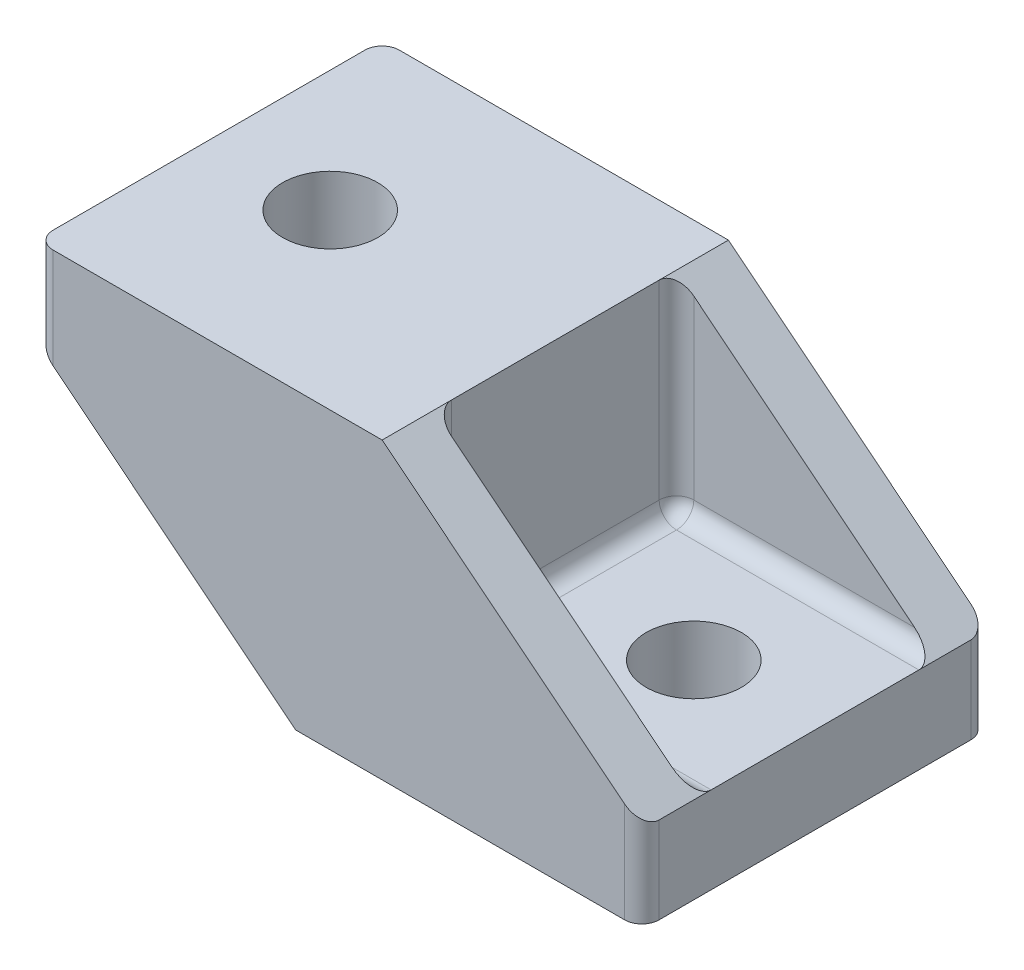
ISO-10303-21;
HEADER;
FILE_DESCRIPTION(('STEP AP214'),'2;1');
FILE_NAME('part.step','',(''),(''),'','','');
FILE_SCHEMA(('AUTOMOTIVE_DESIGN { 1 0 10303 214 1 1 1 1 }'));
ENDSEC;
DATA;
#1=APPLICATION_CONTEXT('core data for automotive mechanical design processes');
#2=APPLICATION_PROTOCOL_DEFINITION('international standard','automotive_design',2000,#1);
#3=PRODUCT_CONTEXT('',#1,'mechanical');
#4=PRODUCT('Part','Part','',(#3));
#5=PRODUCT_RELATED_PRODUCT_CATEGORY('part','',(#4));
#6=PRODUCT_DEFINITION_FORMATION('','',#4);
#7=PRODUCT_DEFINITION_CONTEXT('part definition',#1,'design');
#8=PRODUCT_DEFINITION('design','',#6,#7);
#9=PRODUCT_DEFINITION_SHAPE('','',#8);
#10=(LENGTH_UNIT() NAMED_UNIT(*) SI_UNIT(.MILLI.,.METRE.));
#11=(NAMED_UNIT(*) PLANE_ANGLE_UNIT() SI_UNIT($,.RADIAN.));
#12=(NAMED_UNIT(*) SI_UNIT($,.STERADIAN.) SOLID_ANGLE_UNIT());
#13=UNCERTAINTY_MEASURE_WITH_UNIT(LENGTH_MEASURE(1.E-05),#10,'distance_accuracy_value','');
#14=(GEOMETRIC_REPRESENTATION_CONTEXT(3) GLOBAL_UNCERTAINTY_ASSIGNED_CONTEXT((#13)) GLOBAL_UNIT_ASSIGNED_CONTEXT((#10,
#11,#12)) REPRESENTATION_CONTEXT('',''));
#15=CARTESIAN_POINT('',(0.,0.,0.));
#16=DIRECTION('',(0.,0.,1.));
#17=DIRECTION('',(1.,0.,0.));
#18=AXIS2_PLACEMENT_3D('',#15,#16,#17);
#19=CARTESIAN_POINT('',(0.,12.,10.));
#20=DIRECTION('',(0.,1.,0.));
#21=DIRECTION('',(-1.,0.,0.));
#22=AXIS2_PLACEMENT_3D('',#19,#20,#21);
#23=PLANE('',#22);
#24=CARTESIAN_POINT('',(-8.,12.,0.));
#25=DIRECTION('',(0.,1.,0.));
#26=DIRECTION('',(-1.,0.,0.));
#27=AXIS2_PLACEMENT_3D('',#24,#25,#26);
#28=CIRCLE('',#27,2.75);
#29=CARTESIAN_POINT('',(-10.75,12.,0.));
#30=VERTEX_POINT('',#29);
#31=EDGE_CURVE('E251',#30,#30,#28,.T.);
#32=ORIENTED_EDGE('',*,*,#31,.T.);
#33=EDGE_LOOP('',(#32));
#34=FACE_BOUND('',#33,.T.);
#35=DIRECTION('',(0.,0.,-1.));
#36=VECTOR('',#35,1.);
#37=CARTESIAN_POINT('',(-0.999999999999999,12.,7.));
#38=LINE('',#37,#36);
#39=CARTESIAN_POINT('',(-0.999999999999999,12.,-6.));
#40=VERTEX_POINT('',#39);
#41=CARTESIAN_POINT('',(-0.999999999999999,12.,6.));
#42=VERTEX_POINT('',#41);
#43=EDGE_CURVE('E320',#40,#42,#38,.F.);
#44=ORIENTED_EDGE('',*,*,#43,.T.);
#45=DIRECTION('',(1.,0.,0.));
#46=VECTOR('',#45,1.);
#47=CARTESIAN_POINT('',(-15.,12.,6.));
#48=LINE('',#47,#46);
#49=CARTESIAN_POINT('',(-15.,12.,6.));
#50=VERTEX_POINT('',#49);
#51=EDGE_CURVE('E323',#42,#50,#48,.F.);
#52=ORIENTED_EDGE('',*,*,#51,.T.);
#53=DIRECTION('',(0.,0.,-1.));
#54=VECTOR('',#53,1.);
#55=CARTESIAN_POINT('',(-15.,12.,10.));
#56=LINE('',#55,#54);
#57=CARTESIAN_POINT('',(-15.,12.,-6.));
#58=VERTEX_POINT('',#57);
#59=EDGE_CURVE('E255',#50,#58,#56,.T.);
#60=ORIENTED_EDGE('',*,*,#59,.T.);
#61=DIRECTION('',(-1.,0.,0.));
#62=VECTOR('',#61,1.);
#63=CARTESIAN_POINT('',(0.,12.,-6.));
#64=LINE('',#63,#62);
#65=EDGE_CURVE('E317',#58,#40,#64,.F.);
#66=ORIENTED_EDGE('',*,*,#65,.T.);
#67=EDGE_LOOP('',(#44,#52,#60,#66));
#68=FACE_BOUND('',#67,.T.);
#69=ADVANCED_FACE('F39',(#34,#68),#23,.F.);
#70=CARTESIAN_POINT('',(0.,0.,10.));
#71=DIRECTION('',(1.,0.,0.));
#72=DIRECTION('',(0.,1.,0.));
#73=AXIS2_PLACEMENT_3D('',#70,#71,#72);
#74=PLANE('',#73);
#75=DIRECTION('',(0.,0.,-1.));
#76=VECTOR('',#75,1.);
#77=CARTESIAN_POINT('',(0.,11.,-7.));
#78=LINE('',#77,#76);
#79=CARTESIAN_POINT('',(0.,11.,6.));
#80=VERTEX_POINT('',#79);
#81=CARTESIAN_POINT('',(0.,11.,-6.));
#82=VERTEX_POINT('',#81);
#83=EDGE_CURVE('E309',#80,#82,#78,.T.);
#84=ORIENTED_EDGE('',*,*,#83,.T.);
#85=DIRECTION('',(0.,1.,0.));
#86=VECTOR('',#85,1.);
#87=CARTESIAN_POINT('',(0.,0.,-6.));
#88=LINE('',#87,#86);
#89=CARTESIAN_POINT('',(0.,0.,-6.));
#90=VERTEX_POINT('',#89);
#91=EDGE_CURVE('E313',#82,#90,#88,.F.);
#92=ORIENTED_EDGE('',*,*,#91,.T.);
#93=DIRECTION('',(0.,0.,-1.));
#94=VECTOR('',#93,1.);
#95=CARTESIAN_POINT('',(0.,0.,10.));
#96=LINE('',#95,#94);
#97=CARTESIAN_POINT('',(0.,0.,6.));
#98=VERTEX_POINT('',#97);
#99=EDGE_CURVE('E235',#98,#90,#96,.T.);
#100=ORIENTED_EDGE('',*,*,#99,.F.);
#101=DIRECTION('',(0.,-1.,0.));
#102=VECTOR('',#101,1.);
#103=CARTESIAN_POINT('',(0.,12.,6.));
#104=LINE('',#103,#102);
#105=EDGE_CURVE('E306',#98,#80,#104,.F.);
#106=ORIENTED_EDGE('',*,*,#105,.T.);
#107=EDGE_LOOP('',(#84,#92,#100,#106));
#108=FACE_BOUND('',#107,.T.);
#109=ADVANCED_FACE('F492',(#108),#74,.F.);
#110=CARTESIAN_POINT('',(5.,5.,10.));
#111=DIRECTION('',(0.,-1.,0.));
#112=DIRECTION('',(1.,0.,0.));
#113=AXIS2_PLACEMENT_3D('',#110,#111,#112);
#114=PLANE('',#113);
#115=DIRECTION('',(0.,0.,-1.));
#116=VECTOR('',#115,1.);
#117=CARTESIAN_POINT('',(20.,5.,10.));
#118=LINE('',#117,#116);
#119=CARTESIAN_POINT('',(20.,5.,6.));
#120=VERTEX_POINT('',#119);
#121=CARTESIAN_POINT('',(20.,5.,-6.));
#122=VERTEX_POINT('',#121);
#123=EDGE_CURVE('E228',#120,#122,#118,.T.);
#124=ORIENTED_EDGE('',*,*,#123,.T.);
#125=DIRECTION('',(1.,0.,0.));
#126=VECTOR('',#125,1.);
#127=CARTESIAN_POINT('',(5.,5.,-6.));
#128=LINE('',#127,#126);
#129=CARTESIAN_POINT('',(6.,5.,-6.));
#130=VERTEX_POINT('',#129);
#131=EDGE_CURVE('E297',#122,#130,#128,.F.);
#132=ORIENTED_EDGE('',*,*,#131,.T.);
#133=DIRECTION('',(0.,0.,-1.));
#134=VECTOR('',#133,1.);
#135=CARTESIAN_POINT('',(6.,5.,7.));
#136=LINE('',#135,#134);
#137=CARTESIAN_POINT('',(6.,5.,6.));
#138=VERTEX_POINT('',#137);
#139=EDGE_CURVE('E290',#130,#138,#136,.F.);
#140=ORIENTED_EDGE('',*,*,#139,.T.);
#141=DIRECTION('',(-1.,0.,0.));
#142=VECTOR('',#141,1.);
#143=CARTESIAN_POINT('',(20.,5.,6.));
#144=LINE('',#143,#142);
#145=EDGE_CURVE('E293',#138,#120,#144,.F.);
#146=ORIENTED_EDGE('',*,*,#145,.T.);
#147=EDGE_LOOP('',(#124,#132,#140,#146));
#148=FACE_BOUND('',#147,.T.);
#149=CARTESIAN_POINT('',(13.,5.,0.));
#150=DIRECTION('',(0.,1.,0.));
#151=DIRECTION('',(-1.,0.,0.));
#152=AXIS2_PLACEMENT_3D('',#149,#150,#151);
#153=CIRCLE('',#152,2.75);
#154=CARTESIAN_POINT('',(10.25,5.,0.));
#155=VERTEX_POINT('',#154);
#156=EDGE_CURVE('E544',#155,#155,#153,.T.);
#157=ORIENTED_EDGE('',*,*,#156,.F.);
#158=EDGE_LOOP('',(#157));
#159=FACE_BOUND('',#158,.T.);
#160=ADVANCED_FACE('F576',(#148,#159),#114,.F.);
#161=CARTESIAN_POINT('',(5.,17.,10.));
#162=DIRECTION('',(-1.,0.,0.));
#163=DIRECTION('',(0.,-1.,0.));
#164=AXIS2_PLACEMENT_3D('',#161,#162,#163);
#165=PLANE('',#164);
#166=DIRECTION('',(0.,0.,-1.));
#167=VECTOR('',#166,1.);
#168=CARTESIAN_POINT('',(5.,6.,-7.));
#169=LINE('',#168,#167);
#170=CARTESIAN_POINT('',(5.,6.,6.));
#171=VERTEX_POINT('',#170);
#172=CARTESIAN_POINT('',(5.,6.,-6.));
#173=VERTEX_POINT('',#172);
#174=EDGE_CURVE('E280',#171,#173,#169,.T.);
#175=ORIENTED_EDGE('',*,*,#174,.T.);
#176=DIRECTION('',(0.,-1.,0.));
#177=VECTOR('',#176,1.);
#178=CARTESIAN_POINT('',(5.,17.,-6.));
#179=LINE('',#178,#177);
#180=CARTESIAN_POINT('',(4.99999999999999,17.,-6.));
#181=VERTEX_POINT('',#180);
#182=EDGE_CURVE('E286',#173,#181,#179,.F.);
#183=ORIENTED_EDGE('',*,*,#182,.T.);
#184=DIRECTION('',(0.,0.,-1.));
#185=VECTOR('',#184,1.);
#186=CARTESIAN_POINT('',(5.,17.,10.));
#187=LINE('',#186,#185);
#188=CARTESIAN_POINT('',(5.,17.,6.));
#189=VERTEX_POINT('',#188);
#190=EDGE_CURVE('E229',#189,#181,#187,.T.);
#191=ORIENTED_EDGE('',*,*,#190,.F.);
#192=DIRECTION('',(0.,1.,0.));
#193=VECTOR('',#192,1.);
#194=CARTESIAN_POINT('',(5.,5.,6.));
#195=LINE('',#194,#193);
#196=EDGE_CURVE('E283',#189,#171,#195,.F.);
#197=ORIENTED_EDGE('',*,*,#196,.T.);
#198=EDGE_LOOP('',(#175,#183,#191,#197));
#199=FACE_BOUND('',#198,.T.);
#200=ADVANCED_FACE('F842',(#199),#165,.F.);
#201=CARTESIAN_POINT('',(20.,0.,10.));
#202=DIRECTION('',(0.,1.,0.));
#203=DIRECTION('',(-1.,0.,0.));
#204=AXIS2_PLACEMENT_3D('',#201,#202,#203);
#205=PLANE('',#204);
#206=DIRECTION('',(1.,0.,0.));
#207=VECTOR('',#206,1.);
#208=CARTESIAN_POINT('',(20.,0.,-10.));
#209=LINE('',#208,#207);
#210=CARTESIAN_POINT('',(0.,0.,-10.));
#211=VERTEX_POINT('',#210);
#212=CARTESIAN_POINT('',(19.,0.,-10.));
#213=VERTEX_POINT('',#212);
#214=EDGE_CURVE('E247',#211,#213,#209,.T.);
#215=ORIENTED_EDGE('',*,*,#214,.T.);
#216=CARTESIAN_POINT('',(19.,0.,-9.));
#217=DIRECTION('',(0.,1.,0.));
#218=DIRECTION('',(-1.,0.,0.));
#219=AXIS2_PLACEMENT_3D('',#216,#217,#218);
#220=CIRCLE('',#219,1.);
#221=CARTESIAN_POINT('',(20.,0.,-9.));
#222=VERTEX_POINT('',#221);
#223=EDGE_CURVE('E431',#213,#222,#220,.F.);
#224=ORIENTED_EDGE('',*,*,#223,.T.);
#225=DIRECTION('',(0.,0.,-1.));
#226=VECTOR('',#225,1.);
#227=CARTESIAN_POINT('',(20.,0.,10.));
#228=LINE('',#227,#226);
#229=CARTESIAN_POINT('',(20.,0.,9.));
#230=VERTEX_POINT('',#229);
#231=EDGE_CURVE('E265',#230,#222,#228,.T.);
#232=ORIENTED_EDGE('',*,*,#231,.F.);
#233=CARTESIAN_POINT('',(19.,0.,9.));
#234=DIRECTION('',(0.,1.,0.));
#235=DIRECTION('',(-1.,0.,0.));
#236=AXIS2_PLACEMENT_3D('',#233,#234,#235);
#237=CIRCLE('',#236,1.);
#238=CARTESIAN_POINT('',(19.,0.,10.));
#239=VERTEX_POINT('',#238);
#240=EDGE_CURVE('E428',#230,#239,#237,.F.);
#241=ORIENTED_EDGE('',*,*,#240,.T.);
#242=DIRECTION('',(1.,0.,0.));
#243=VECTOR('',#242,1.);
#244=CARTESIAN_POINT('',(20.,0.,10.));
#245=LINE('',#244,#243);
#246=CARTESIAN_POINT('',(0.,0.,10.));
#247=VERTEX_POINT('',#246);
#248=EDGE_CURVE('E236',#247,#239,#245,.T.);
#249=ORIENTED_EDGE('',*,*,#248,.F.);
#250=EDGE_CURVE('E241',#247,#98,#96,.T.);
#251=ORIENTED_EDGE('',*,*,#250,.T.);
#252=ORIENTED_EDGE('',*,*,#99,.T.);
#253=DIRECTION('',(0.,0.,1.));
#254=VECTOR('',#253,1.);
#255=CARTESIAN_POINT('',(0.,0.,10.));
#256=LINE('',#255,#254);
#257=EDGE_CURVE('E523',#90,#211,#256,.F.);
#258=ORIENTED_EDGE('',*,*,#257,.T.);
#259=EDGE_LOOP('',(#215,#224,#232,#241,#249,#251,#252,#258));
#260=FACE_BOUND('',#259,.T.);
#261=CARTESIAN_POINT('',(13.,0.,0.));
#262=DIRECTION('',(0.,1.,0.));
#263=DIRECTION('',(-1.,0.,0.));
#264=AXIS2_PLACEMENT_3D('',#261,#262,#263);
#265=CIRCLE('',#264,2.75);
#266=CARTESIAN_POINT('',(10.25,0.,0.));
#267=VERTEX_POINT('',#266);
#268=EDGE_CURVE('E545',#267,#267,#265,.T.);
#269=ORIENTED_EDGE('',*,*,#268,.T.);
#270=EDGE_LOOP('',(#269));
#271=FACE_BOUND('',#270,.T.);
#272=ADVANCED_FACE('F566',(#260,#271),#205,.F.);
#273=CARTESIAN_POINT('',(20.,5.,10.));
#274=DIRECTION('',(-1.,0.,0.));
#275=DIRECTION('',(0.,0.,1.));
#276=AXIS2_PLACEMENT_3D('',#273,#274,#275);
#277=PLANE('',#276);
#278=ORIENTED_EDGE('',*,*,#231,.T.);
#279=DIRECTION('',(0.,1.,0.));
#280=VECTOR('',#279,1.);
#281=CARTESIAN_POINT('',(20.,5.,-9.));
#282=LINE('',#281,#280);
#283=CARTESIAN_POINT('',(20.,5.,-9.));
#284=VERTEX_POINT('',#283);
#285=EDGE_CURVE('E415',#222,#284,#282,.T.);
#286=ORIENTED_EDGE('',*,*,#285,.T.);
#287=DIRECTION('',(0.,0.,-1.));
#288=VECTOR('',#287,1.);
#289=CARTESIAN_POINT('',(20.,5.,10.));
#290=LINE('',#289,#288);
#291=EDGE_CURVE('E541',#284,#122,#290,.F.);
#292=ORIENTED_EDGE('',*,*,#291,.T.);
#293=ORIENTED_EDGE('',*,*,#123,.F.);
#294=CARTESIAN_POINT('',(20.,5.,9.));
#295=VERTEX_POINT('',#294);
#296=EDGE_CURVE('E262',#295,#120,#118,.T.);
#297=ORIENTED_EDGE('',*,*,#296,.F.);
#298=DIRECTION('',(0.,1.,0.));
#299=VECTOR('',#298,1.);
#300=CARTESIAN_POINT('',(20.,5.,9.));
#301=LINE('',#300,#299);
#302=EDGE_CURVE('E365',#295,#230,#301,.F.);
#303=ORIENTED_EDGE('',*,*,#302,.T.);
#304=EDGE_LOOP('',(#278,#286,#292,#293,#297,#303));
#305=FACE_BOUND('',#304,.T.);
#306=ADVANCED_FACE('F559',(#305),#277,.F.);
#307=CARTESIAN_POINT('',(-15.,17.,10.));
#308=DIRECTION('',(0.,-1.,0.));
#309=DIRECTION('',(0.,0.,-1.));
#310=AXIS2_PLACEMENT_3D('',#307,#308,#309);
#311=PLANE('',#310);
#312=DIRECTION('',(0.,0.,-1.));
#313=VECTOR('',#312,1.);
#314=CARTESIAN_POINT('',(-15.,17.,10.));
#315=LINE('',#314,#313);
#316=CARTESIAN_POINT('',(-15.,17.,9.));
#317=VERTEX_POINT('',#316);
#318=CARTESIAN_POINT('',(-15.,17.,-9.));
#319=VERTEX_POINT('',#318);
#320=EDGE_CURVE('E259',#317,#319,#315,.T.);
#321=ORIENTED_EDGE('',*,*,#320,.F.);
#322=CARTESIAN_POINT('',(-14.,17.,9.));
#323=DIRECTION('',(0.,-1.,0.));
#324=DIRECTION('',(0.,0.,-1.));
#325=AXIS2_PLACEMENT_3D('',#322,#323,#324);
#326=CIRCLE('',#325,1.);
#327=CARTESIAN_POINT('',(-14.,17.,10.));
#328=VERTEX_POINT('',#327);
#329=EDGE_CURVE('E48',#317,#328,#326,.F.);
#330=ORIENTED_EDGE('',*,*,#329,.T.);
#331=DIRECTION('',(-1.,0.,0.));
#332=VECTOR('',#331,1.);
#333=CARTESIAN_POINT('',(-15.,17.,10.));
#334=LINE('',#333,#332);
#335=CARTESIAN_POINT('',(5.,17.,10.));
#336=VERTEX_POINT('',#335);
#337=EDGE_CURVE('E209',#336,#328,#334,.T.);
#338=ORIENTED_EDGE('',*,*,#337,.F.);
#339=EDGE_CURVE('E219',#336,#189,#187,.T.);
#340=ORIENTED_EDGE('',*,*,#339,.T.);
#341=ORIENTED_EDGE('',*,*,#190,.T.);
#342=DIRECTION('',(0.,0.,-1.));
#343=VECTOR('',#342,1.);
#344=CARTESIAN_POINT('',(4.99999999999999,17.,10.));
#345=LINE('',#344,#343);
#346=CARTESIAN_POINT('',(5.,17.,-10.));
#347=VERTEX_POINT('',#346);
#348=EDGE_CURVE('E535',#347,#181,#345,.F.);
#349=ORIENTED_EDGE('',*,*,#348,.F.);
#350=DIRECTION('',(-1.,0.,0.));
#351=VECTOR('',#350,1.);
#352=CARTESIAN_POINT('',(-15.,17.,-10.));
#353=LINE('',#352,#351);
#354=CARTESIAN_POINT('',(-14.,17.,-10.));
#355=VERTEX_POINT('',#354);
#356=EDGE_CURVE('E243',#347,#355,#353,.T.);
#357=ORIENTED_EDGE('',*,*,#356,.T.);
#358=CARTESIAN_POINT('',(-14.,17.,-9.));
#359=DIRECTION('',(0.,-1.,0.));
#360=DIRECTION('',(0.,0.,-1.));
#361=AXIS2_PLACEMENT_3D('',#358,#359,#360);
#362=CIRCLE('',#361,1.);
#363=EDGE_CURVE('E61',#355,#319,#362,.F.);
#364=ORIENTED_EDGE('',*,*,#363,.T.);
#365=EDGE_LOOP('',(#321,#330,#338,#340,#341,#349,#357,#364));
#366=FACE_BOUND('',#365,.T.);
#367=CARTESIAN_POINT('',(-8.,17.,0.));
#368=DIRECTION('',(0.,1.,0.));
#369=DIRECTION('',(0.,0.,1.));
#370=AXIS2_PLACEMENT_3D('',#367,#368,#369);
#371=CIRCLE('',#370,2.75);
#372=CARTESIAN_POINT('',(-8.,17.,2.75));
#373=VERTEX_POINT('',#372);
#374=EDGE_CURVE('E273',#373,#373,#371,.T.);
#375=ORIENTED_EDGE('',*,*,#374,.F.);
#376=EDGE_LOOP('',(#375));
#377=FACE_BOUND('',#376,.T.);
#378=ADVANCED_FACE('F231',(#366,#377),#311,.F.);
#379=CARTESIAN_POINT('',(-15.,12.,10.));
#380=DIRECTION('',(1.,0.,0.));
#381=DIRECTION('',(0.,0.,-1.));
#382=AXIS2_PLACEMENT_3D('',#379,#380,#381);
#383=PLANE('',#382);
#384=CARTESIAN_POINT('',(-15.,12.,9.));
#385=VERTEX_POINT('',#384);
#386=EDGE_CURVE('E256',#385,#50,#56,.T.);
#387=ORIENTED_EDGE('',*,*,#386,.F.);
#388=DIRECTION('',(0.,-1.,0.));
#389=VECTOR('',#388,1.);
#390=CARTESIAN_POINT('',(-15.,12.,9.));
#391=LINE('',#390,#389);
#392=EDGE_CURVE('E448',#385,#317,#391,.F.);
#393=ORIENTED_EDGE('',*,*,#392,.T.);
#394=ORIENTED_EDGE('',*,*,#320,.T.);
#395=DIRECTION('',(0.,-1.,0.));
#396=VECTOR('',#395,1.);
#397=CARTESIAN_POINT('',(-15.,12.,-9.));
#398=LINE('',#397,#396);
#399=CARTESIAN_POINT('',(-15.,12.,-9.));
#400=VERTEX_POINT('',#399);
#401=EDGE_CURVE('E445',#319,#400,#398,.T.);
#402=ORIENTED_EDGE('',*,*,#401,.T.);
#403=DIRECTION('',(0.,0.,-1.));
#404=VECTOR('',#403,1.);
#405=CARTESIAN_POINT('',(-15.,12.,10.));
#406=LINE('',#405,#404);
#407=EDGE_CURVE('E471',#400,#58,#406,.F.);
#408=ORIENTED_EDGE('',*,*,#407,.T.);
#409=ORIENTED_EDGE('',*,*,#59,.F.);
#410=EDGE_LOOP('',(#387,#393,#394,#402,#408,#409));
#411=FACE_BOUND('',#410,.T.);
#412=ADVANCED_FACE('F558',(#411),#383,.F.);
#413=CARTESIAN_POINT('',(0.,0.,10.));
#414=DIRECTION('',(0.,0.,-1.));
#415=DIRECTION('',(-1.,0.,0.));
#416=AXIS2_PLACEMENT_3D('',#413,#414,#415);
#417=PLANE('',#416);
#418=ORIENTED_EDGE('',*,*,#248,.T.);
#419=DIRECTION('',(0.,1.,0.));
#420=VECTOR('',#419,1.);
#421=CARTESIAN_POINT('',(19.,0.,10.));
#422=LINE('',#421,#420);
#423=CARTESIAN_POINT('',(19.,5.8,10.));
#424=VERTEX_POINT('',#423);
#425=EDGE_CURVE('E212',#239,#424,#422,.T.);
#426=ORIENTED_EDGE('',*,*,#425,.T.);
#427=DIRECTION('',(-0.78086880944303,0.624695047554424,0.));
#428=VECTOR('',#427,1.);
#429=CARTESIAN_POINT('',(20.,5.,10.));
#430=LINE('',#429,#428);
#431=EDGE_CURVE('E203',#424,#336,#430,.T.);
#432=ORIENTED_EDGE('',*,*,#431,.T.);
#433=ORIENTED_EDGE('',*,*,#337,.T.);
#434=DIRECTION('',(0.,-1.,0.));
#435=VECTOR('',#434,1.);
#436=CARTESIAN_POINT('',(-14.,0.,10.));
#437=LINE('',#436,#435);
#438=CARTESIAN_POINT('',(-14.,11.2,10.));
#439=VERTEX_POINT('',#438);
#440=EDGE_CURVE('E434',#328,#439,#437,.T.);
#441=ORIENTED_EDGE('',*,*,#440,.T.);
#442=DIRECTION('',(0.78086880944303,-0.624695047554424,0.));
#443=VECTOR('',#442,1.);
#444=CARTESIAN_POINT('',(-15.,12.,10.));
#445=LINE('',#444,#443);
#446=EDGE_CURVE('E513',#439,#247,#445,.T.);
#447=ORIENTED_EDGE('',*,*,#446,.T.);
#448=EDGE_LOOP('',(#418,#426,#432,#433,#441,#447));
#449=FACE_BOUND('',#448,.T.);
#450=ADVANCED_FACE('F206',(#449),#417,.F.);
#451=CARTESIAN_POINT('',(0.,0.,-10.));
#452=DIRECTION('',(0.,0.,-1.));
#453=DIRECTION('',(-1.,0.,0.));
#454=AXIS2_PLACEMENT_3D('',#451,#452,#453);
#455=PLANE('',#454);
#456=DIRECTION('',(-0.78086880944303,0.624695047554424,0.));
#457=VECTOR('',#456,1.);
#458=CARTESIAN_POINT('',(20.,5.,-10.));
#459=LINE('',#458,#457);
#460=CARTESIAN_POINT('',(19.,5.8,-10.));
#461=VERTEX_POINT('',#460);
#462=EDGE_CURVE('E532',#461,#347,#459,.T.);
#463=ORIENTED_EDGE('',*,*,#462,.F.);
#464=DIRECTION('',(0.,1.,0.));
#465=VECTOR('',#464,1.);
#466=CARTESIAN_POINT('',(19.,0.,-10.));
#467=LINE('',#466,#465);
#468=EDGE_CURVE('E425',#461,#213,#467,.F.);
#469=ORIENTED_EDGE('',*,*,#468,.T.);
#470=ORIENTED_EDGE('',*,*,#214,.F.);
#471=DIRECTION('',(0.78086880944303,-0.624695047554424,0.));
#472=VECTOR('',#471,1.);
#473=CARTESIAN_POINT('',(-15.,12.,-10.));
#474=LINE('',#473,#472);
#475=CARTESIAN_POINT('',(-14.,11.2,-10.));
#476=VERTEX_POINT('',#475);
#477=EDGE_CURVE('E520',#476,#211,#474,.T.);
#478=ORIENTED_EDGE('',*,*,#477,.F.);
#479=DIRECTION('',(0.,-1.,0.));
#480=VECTOR('',#479,1.);
#481=CARTESIAN_POINT('',(-14.,17.,-10.));
#482=LINE('',#481,#480);
#483=EDGE_CURVE('E422',#476,#355,#482,.F.);
#484=ORIENTED_EDGE('',*,*,#483,.T.);
#485=ORIENTED_EDGE('',*,*,#356,.F.);
#486=EDGE_LOOP('',(#463,#469,#470,#478,#484,#485));
#487=FACE_BOUND('',#486,.T.);
#488=ADVANCED_FACE('F579',(#487),#455,.T.);
#489=CARTESIAN_POINT('',(-8.,0.,0.));
#490=DIRECTION('',(0.,1.,0.));
#491=DIRECTION('',(0.,0.,1.));
#492=AXIS2_PLACEMENT_3D('',#489,#490,#491);
#493=CYLINDRICAL_SURFACE('',#492,2.75);
#494=ORIENTED_EDGE('',*,*,#374,.T.);
#495=EDGE_LOOP('',(#494));
#496=FACE_BOUND('',#495,.T.);
#497=ORIENTED_EDGE('',*,*,#31,.F.);
#498=EDGE_LOOP('',(#497));
#499=FACE_BOUND('',#498,.T.);
#500=ADVANCED_FACE('F555',(#496,#499),#493,.F.);
#501=CARTESIAN_POINT('',(13.,0.,0.));
#502=DIRECTION('',(0.,1.,0.));
#503=DIRECTION('',(-1.,0.,0.));
#504=AXIS2_PLACEMENT_3D('',#501,#502,#503);
#505=CYLINDRICAL_SURFACE('',#504,2.75);
#506=CARTESIAN_POINT('',(10.25,0.,0.));
#507=CARTESIAN_POINT('',(10.25,0.0520833333333309,0.));
#508=CARTESIAN_POINT('',(10.25,0.104166666666664,0.));
#509=CARTESIAN_POINT('',(10.25,0.208333333333331,0.));
#510=CARTESIAN_POINT('',(10.25,0.260416666666664,0.));
#511=CARTESIAN_POINT('',(10.25,0.364583333333331,0.));
#512=CARTESIAN_POINT('',(10.25,0.416666666666664,0.));
#513=CARTESIAN_POINT('',(10.25,0.520833333333331,0.));
#514=CARTESIAN_POINT('',(10.25,0.572916666666664,0.));
#515=CARTESIAN_POINT('',(10.25,0.677083333333331,0.));
#516=CARTESIAN_POINT('',(10.25,0.729166666666665,0.));
#517=CARTESIAN_POINT('',(10.25,0.833333333333331,0.));
#518=CARTESIAN_POINT('',(10.25,0.885416666666665,0.));
#519=CARTESIAN_POINT('',(10.25,0.989583333333331,0.));
#520=CARTESIAN_POINT('',(10.25,1.04166666666666,0.));
#521=CARTESIAN_POINT('',(10.25,1.14583333333333,0.));
#522=CARTESIAN_POINT('',(10.25,1.19791666666666,0.));
#523=CARTESIAN_POINT('',(10.25,1.30208333333333,0.));
#524=CARTESIAN_POINT('',(10.25,1.35416666666666,0.));
#525=CARTESIAN_POINT('',(10.25,1.45833333333333,0.));
#526=CARTESIAN_POINT('',(10.25,1.51041666666666,0.));
#527=CARTESIAN_POINT('',(10.25,1.61458333333333,0.));
#528=CARTESIAN_POINT('',(10.25,1.66666666666666,0.));
#529=CARTESIAN_POINT('',(10.25,1.77083333333333,0.));
#530=CARTESIAN_POINT('',(10.25,1.82291666666666,0.));
#531=CARTESIAN_POINT('',(10.25,1.92708333333333,0.));
#532=CARTESIAN_POINT('',(10.25,1.97916666666666,0.));
#533=CARTESIAN_POINT('',(10.25,2.08333333333333,0.));
#534=CARTESIAN_POINT('',(10.25,2.13541666666666,0.));
#535=CARTESIAN_POINT('',(10.25,2.23958333333333,0.));
#536=CARTESIAN_POINT('',(10.25,2.29166666666666,0.));
#537=CARTESIAN_POINT('',(10.25,2.39583333333333,0.));
#538=CARTESIAN_POINT('',(10.25,2.44791666666667,0.));
#539=CARTESIAN_POINT('',(10.25,2.55208333333333,0.));
#540=CARTESIAN_POINT('',(10.25,2.60416666666667,0.));
#541=CARTESIAN_POINT('',(10.25,2.70833333333333,0.));
#542=CARTESIAN_POINT('',(10.25,2.76041666666667,0.));
#543=CARTESIAN_POINT('',(10.25,2.86458333333333,0.));
#544=CARTESIAN_POINT('',(10.25,2.91666666666667,0.));
#545=CARTESIAN_POINT('',(10.25,3.02083333333333,0.));
#546=CARTESIAN_POINT('',(10.25,3.07291666666667,0.));
#547=CARTESIAN_POINT('',(10.25,3.17708333333333,0.));
#548=CARTESIAN_POINT('',(10.25,3.22916666666667,0.));
#549=CARTESIAN_POINT('',(10.25,3.33333333333333,0.));
#550=CARTESIAN_POINT('',(10.25,3.38541666666667,0.));
#551=CARTESIAN_POINT('',(10.25,3.48958333333333,0.));
#552=CARTESIAN_POINT('',(10.25,3.54166666666667,0.));
#553=CARTESIAN_POINT('',(10.25,3.64583333333333,0.));
#554=CARTESIAN_POINT('',(10.25,3.69791666666667,0.));
#555=CARTESIAN_POINT('',(10.25,3.80208333333333,0.));
#556=CARTESIAN_POINT('',(10.25,3.85416666666667,0.));
#557=CARTESIAN_POINT('',(10.25,3.95833333333333,0.));
#558=CARTESIAN_POINT('',(10.25,4.01041666666666,0.));
#559=CARTESIAN_POINT('',(10.25,4.11458333333333,0.));
#560=CARTESIAN_POINT('',(10.25,4.16666666666667,0.));
#561=CARTESIAN_POINT('',(10.25,4.27083333333333,0.));
#562=CARTESIAN_POINT('',(10.25,4.32291666666667,0.));
#563=CARTESIAN_POINT('',(10.25,4.42708333333333,0.));
#564=CARTESIAN_POINT('',(10.25,4.47916666666667,0.));
#565=CARTESIAN_POINT('',(10.25,4.58333333333333,0.));
#566=CARTESIAN_POINT('',(10.25,4.63541666666667,0.));
#567=CARTESIAN_POINT('',(10.25,4.73958333333333,0.));
#568=CARTESIAN_POINT('',(10.25,4.79166666666667,0.));
#569=CARTESIAN_POINT('',(10.25,4.89583333333333,0.));
#570=CARTESIAN_POINT('',(10.25,4.94791666666667,0.));
#571=CARTESIAN_POINT('',(10.25,5.,0.));
#572=B_SPLINE_CURVE_WITH_KNOTS('',3,(#506,#507,#508,#509,#510,#511,#512,#513,#514,#515,#516,
#517,#518,#519,#520,#521,#522,#523,#524,#525,#526,#527,#528,#529,#530,#531,#532,#533,#534,#535,
#536,#537,#538,#539,#540,#541,#542,#543,#544,#545,#546,#547,#548,#549,#550,#551,#552,#553,#554,
#555,#556,#557,#558,#559,#560,#561,#562,#563,#564,#565,#566,#567,#568,#569,#570,#571),
.UNSPECIFIED.,.F.,.F.,(4,2,2,2,2,2,2,2,2,2,2,2,2,2,2,2,2,2,2,2,2,2,2,2,2,2,2,2,2,2,2,2,4),(0.,
0.15625,0.3125,0.46875,0.625,0.78125,0.9375,1.09375,1.25,1.40625,1.5625,1.71875,1.875,2.03125,
2.1875,2.34375,2.5,2.65625,2.8125,2.96875,3.125,3.28125,3.4375,3.59375,3.75,3.90625,4.0625,
4.21875,4.375,4.53125,4.6875,4.84375,5.),.UNSPECIFIED.);
#573=EDGE_CURVE('BSEAM587',#267,#155,#572,.T.);
#574=ORIENTED_EDGE('',*,*,#268,.F.);
#575=ORIENTED_EDGE('',*,*,#156,.T.);
#576=ORIENTED_EDGE('',*,*,#573,.T.);
#577=ORIENTED_EDGE('',*,*,#573,.F.);
#578=EDGE_LOOP('',(#574,#576,#575,#577));
#579=FACE_BOUND('',#578,.T.);
#580=ADVANCED_FACE('F587',(#579),#505,.F.);
#581=CARTESIAN_POINT('',(2.5,8.5,-7.));
#582=DIRECTION('',(0.,0.,-1.));
#583=DIRECTION('',(-1.,0.,0.));
#584=AXIS2_PLACEMENT_3D('',#581,#582,#583);
#585=PLANE('',#584);
#586=DIRECTION('',(-0.78086880944303,0.624695047554424,0.));
#587=VECTOR('',#586,1.);
#588=CARTESIAN_POINT('',(20.,5.,-7.));
#589=LINE('',#588,#587);
#590=CARTESIAN_POINT('',(18.75,6.,-7.));
#591=VERTEX_POINT('',#590);
#592=CARTESIAN_POINT('',(6.,16.2,-7.));
#593=VERTEX_POINT('',#592);
#594=EDGE_CURVE('E531',#591,#593,#589,.T.);
#595=ORIENTED_EDGE('',*,*,#594,.T.);
#596=DIRECTION('',(0.,-1.,0.));
#597=VECTOR('',#596,1.);
#598=CARTESIAN_POINT('',(6.,5.,-7.));
#599=LINE('',#598,#597);
#600=CARTESIAN_POINT('',(6.,6.,-7.));
#601=VERTEX_POINT('',#600);
#602=EDGE_CURVE('E276',#593,#601,#599,.T.);
#603=ORIENTED_EDGE('',*,*,#602,.T.);
#604=DIRECTION('',(1.,0.,0.));
#605=VECTOR('',#604,1.);
#606=CARTESIAN_POINT('',(20.,6.,-7.));
#607=LINE('',#606,#605);
#608=EDGE_CURVE('E269',#601,#591,#607,.T.);
#609=ORIENTED_EDGE('',*,*,#608,.T.);
#610=EDGE_LOOP('',(#595,#603,#609));
#611=FACE_BOUND('',#610,.T.);
#612=ADVANCED_FACE('F590',(#611),#585,.F.);
#613=CARTESIAN_POINT('',(20.,5.,-10.));
#614=DIRECTION('',(-0.624695047554424,-0.78086880944303,0.));
#615=DIRECTION('',(-0.78086880944303,0.624695047554424,0.));
#616=AXIS2_PLACEMENT_3D('',#613,#614,#615);
#617=PLANE('',#616);
#618=ORIENTED_EDGE('',*,*,#291,.F.);
#619=CARTESIAN_POINT('',(19.,5.8,-9.));
#620=DIRECTION('',(-0.624695047554424,-0.78086880944303,0.));
#621=DIRECTION('',(0.78086880944303,-0.624695047554424,0.));
#622=AXIS2_PLACEMENT_3D('',#619,#620,#621);
#623=ELLIPSE('',#622,1.28062484748657,1.);
#624=EDGE_CURVE('E419',#284,#461,#623,.F.);
#625=ORIENTED_EDGE('',*,*,#624,.T.);
#626=ORIENTED_EDGE('',*,*,#462,.T.);
#627=ORIENTED_EDGE('',*,*,#348,.T.);
#628=CARTESIAN_POINT('',(6.,16.2,-6.));
#629=DIRECTION('',(-0.624695047554424,-0.78086880944303,0.));
#630=DIRECTION('',(-0.78086880944303,0.624695047554424,0.));
#631=AXIS2_PLACEMENT_3D('',#628,#629,#630);
#632=ELLIPSE('',#631,1.28062484748657,1.);
#633=EDGE_CURVE('E339',#181,#593,#632,.T.);
#634=ORIENTED_EDGE('',*,*,#633,.T.);
#635=ORIENTED_EDGE('',*,*,#594,.F.);
#636=CARTESIAN_POINT('',(18.75,6.,-6.));
#637=DIRECTION('',(-0.624695047554424,-0.78086880944303,0.));
#638=DIRECTION('',(-0.78086880944303,0.624695047554424,0.));
#639=AXIS2_PLACEMENT_3D('',#636,#637,#638);
#640=ELLIPSE('',#639,1.60078105935821,1.);
#641=EDGE_CURVE('E342',#591,#122,#640,.T.);
#642=ORIENTED_EDGE('',*,*,#641,.T.);
#643=EDGE_LOOP('',(#618,#625,#626,#627,#634,#635,#642));
#644=FACE_BOUND('',#643,.T.);
#645=ADVANCED_FACE('F592',(#644),#617,.F.);
#646=CARTESIAN_POINT('',(-15.,12.,-10.));
#647=DIRECTION('',(0.624695047554424,0.78086880944303,0.));
#648=DIRECTION('',(0.78086880944303,-0.624695047554424,0.));
#649=AXIS2_PLACEMENT_3D('',#646,#647,#648);
#650=PLANE('',#649);
#651=ORIENTED_EDGE('',*,*,#407,.F.);
#652=CARTESIAN_POINT('',(-14.,11.2,-9.));
#653=DIRECTION('',(0.624695047554424,0.78086880944303,0.));
#654=DIRECTION('',(-0.78086880944303,0.624695047554424,0.));
#655=AXIS2_PLACEMENT_3D('',#652,#653,#654);
#656=ELLIPSE('',#655,1.28062484748657,1.);
#657=EDGE_CURVE('E11',#400,#476,#656,.F.);
#658=ORIENTED_EDGE('',*,*,#657,.T.);
#659=ORIENTED_EDGE('',*,*,#477,.T.);
#660=ORIENTED_EDGE('',*,*,#257,.F.);
#661=CARTESIAN_POINT('',(-1.,0.800000000000003,-6.));
#662=DIRECTION('',(0.624695047554424,0.78086880944303,0.));
#663=DIRECTION('',(0.78086880944303,-0.624695047554424,0.));
#664=AXIS2_PLACEMENT_3D('',#661,#662,#663);
#665=ELLIPSE('',#664,1.28062484748657,1.);
#666=CARTESIAN_POINT('',(-1.,0.800000000000002,-7.));
#667=VERTEX_POINT('',#666);
#668=EDGE_CURVE('E351',#90,#667,#665,.T.);
#669=ORIENTED_EDGE('',*,*,#668,.T.);
#670=DIRECTION('',(0.78086880944303,-0.624695047554424,0.));
#671=VECTOR('',#670,1.);
#672=CARTESIAN_POINT('',(-15.,12.,-7.));
#673=LINE('',#672,#671);
#674=CARTESIAN_POINT('',(-13.75,11.,-7.));
#675=VERTEX_POINT('',#674);
#676=EDGE_CURVE('E215',#675,#667,#673,.T.);
#677=ORIENTED_EDGE('',*,*,#676,.F.);
#678=CARTESIAN_POINT('',(-13.75,11.,-6.));
#679=DIRECTION('',(0.624695047554424,0.78086880944303,0.));
#680=DIRECTION('',(0.78086880944303,-0.624695047554424,0.));
#681=AXIS2_PLACEMENT_3D('',#678,#679,#680);
#682=ELLIPSE('',#681,1.60078105935821,1.);
#683=EDGE_CURVE('E361',#675,#58,#682,.T.);
#684=ORIENTED_EDGE('',*,*,#683,.T.);
#685=EDGE_LOOP('',(#651,#658,#659,#660,#669,#677,#684));
#686=FACE_BOUND('',#685,.T.);
#687=ADVANCED_FACE('F470',(#686),#650,.F.);
#688=CARTESIAN_POINT('',(2.5,8.5,-7.));
#689=DIRECTION('',(0.,0.,-1.));
#690=DIRECTION('',(-1.,0.,0.));
#691=AXIS2_PLACEMENT_3D('',#688,#689,#690);
#692=PLANE('',#691);
#693=ORIENTED_EDGE('',*,*,#676,.T.);
#694=DIRECTION('',(0.,1.,0.));
#695=VECTOR('',#694,1.);
#696=CARTESIAN_POINT('',(-0.999999999999998,12.,-7.));
#697=LINE('',#696,#695);
#698=CARTESIAN_POINT('',(-0.999999999999999,11.,-7.));
#699=VERTEX_POINT('',#698);
#700=EDGE_CURVE('E330',#667,#699,#697,.T.);
#701=ORIENTED_EDGE('',*,*,#700,.T.);
#702=DIRECTION('',(-1.,0.,0.));
#703=VECTOR('',#702,1.);
#704=CARTESIAN_POINT('',(-15.,11.,-7.));
#705=LINE('',#704,#703);
#706=EDGE_CURVE('E327',#699,#675,#705,.T.);
#707=ORIENTED_EDGE('',*,*,#706,.T.);
#708=EDGE_LOOP('',(#693,#701,#707));
#709=FACE_BOUND('',#708,.T.);
#710=ADVANCED_FACE('F601',(#709),#692,.F.);
#711=CARTESIAN_POINT('',(2.5,8.5,7.));
#712=DIRECTION('',(0.,0.,1.));
#713=DIRECTION('',(1.,0.,0.));
#714=AXIS2_PLACEMENT_3D('',#711,#712,#713);
#715=PLANE('',#714);
#716=DIRECTION('',(-0.78086880944303,0.624695047554424,0.));
#717=VECTOR('',#716,1.);
#718=CARTESIAN_POINT('',(20.,5.,7.));
#719=LINE('',#718,#717);
#720=CARTESIAN_POINT('',(18.75,6.,7.));
#721=VERTEX_POINT('',#720);
#722=CARTESIAN_POINT('',(6.,16.2,7.));
#723=VERTEX_POINT('',#722);
#724=EDGE_CURVE('E216',#721,#723,#719,.T.);
#725=ORIENTED_EDGE('',*,*,#724,.F.);
#726=DIRECTION('',(-1.,0.,0.));
#727=VECTOR('',#726,1.);
#728=CARTESIAN_POINT('',(5.,6.,7.));
#729=LINE('',#728,#727);
#730=CARTESIAN_POINT('',(6.,6.,7.));
#731=VERTEX_POINT('',#730);
#732=EDGE_CURVE('E303',#721,#731,#729,.T.);
#733=ORIENTED_EDGE('',*,*,#732,.T.);
#734=DIRECTION('',(0.,1.,0.));
#735=VECTOR('',#734,1.);
#736=CARTESIAN_POINT('',(6.,17.,7.));
#737=LINE('',#736,#735);
#738=EDGE_CURVE('E300',#731,#723,#737,.T.);
#739=ORIENTED_EDGE('',*,*,#738,.T.);
#740=EDGE_LOOP('',(#725,#733,#739));
#741=FACE_BOUND('',#740,.T.);
#742=ADVANCED_FACE('F604',(#741),#715,.F.);
#743=CARTESIAN_POINT('',(20.,5.,10.));
#744=DIRECTION('',(0.624695047554424,0.78086880944303,0.));
#745=DIRECTION('',(-0.78086880944303,0.624695047554424,0.));
#746=AXIS2_PLACEMENT_3D('',#743,#744,#745);
#747=PLANE('',#746);
#748=ORIENTED_EDGE('',*,*,#431,.F.);
#749=CARTESIAN_POINT('',(19.,5.8,9.));
#750=DIRECTION('',(0.624695047554424,0.78086880944303,0.));
#751=DIRECTION('',(-0.78086880944303,0.624695047554424,0.));
#752=AXIS2_PLACEMENT_3D('',#749,#750,#751);
#753=ELLIPSE('',#752,1.28062484748657,1.);
#754=EDGE_CURVE('E439',#424,#295,#753,.T.);
#755=ORIENTED_EDGE('',*,*,#754,.T.);
#756=ORIENTED_EDGE('',*,*,#296,.T.);
#757=CARTESIAN_POINT('',(18.75,6.,6.));
#758=DIRECTION('',(0.624695047554424,0.78086880944303,0.));
#759=DIRECTION('',(0.78086880944303,-0.624695047554424,0.));
#760=AXIS2_PLACEMENT_3D('',#757,#758,#759);
#761=ELLIPSE('',#760,1.60078105935821,1.);
#762=EDGE_CURVE('E346',#120,#721,#761,.F.);
#763=ORIENTED_EDGE('',*,*,#762,.T.);
#764=ORIENTED_EDGE('',*,*,#724,.T.);
#765=CARTESIAN_POINT('',(6.,16.2,6.));
#766=DIRECTION('',(0.624695047554424,0.78086880944303,0.));
#767=DIRECTION('',(0.78086880944303,-0.624695047554424,0.));
#768=AXIS2_PLACEMENT_3D('',#765,#766,#767);
#769=ELLIPSE('',#768,1.28062484748657,1.);
#770=EDGE_CURVE('E223',#723,#189,#769,.F.);
#771=ORIENTED_EDGE('',*,*,#770,.T.);
#772=ORIENTED_EDGE('',*,*,#339,.F.);
#773=EDGE_LOOP('',(#748,#755,#756,#763,#764,#771,#772));
#774=FACE_BOUND('',#773,.T.);
#775=ADVANCED_FACE('F220',(#774),#747,.T.);
#776=CARTESIAN_POINT('',(2.5,8.5,7.));
#777=DIRECTION('',(0.,0.,1.));
#778=DIRECTION('',(1.,0.,0.));
#779=AXIS2_PLACEMENT_3D('',#776,#777,#778);
#780=PLANE('',#779);
#781=DIRECTION('',(1.,0.,0.));
#782=VECTOR('',#781,1.);
#783=CARTESIAN_POINT('',(0.,11.,7.));
#784=LINE('',#783,#782);
#785=CARTESIAN_POINT('',(-13.75,11.,7.));
#786=VERTEX_POINT('',#785);
#787=CARTESIAN_POINT('',(-0.999999999999999,11.,7.));
#788=VERTEX_POINT('',#787);
#789=EDGE_CURVE('E333',#786,#788,#784,.T.);
#790=ORIENTED_EDGE('',*,*,#789,.T.);
#791=DIRECTION('',(0.,-1.,0.));
#792=VECTOR('',#791,1.);
#793=CARTESIAN_POINT('',(-1.,0.,7.));
#794=LINE('',#793,#792);
#795=CARTESIAN_POINT('',(-1.,0.800000000000002,7.));
#796=VERTEX_POINT('',#795);
#797=EDGE_CURVE('E336',#788,#796,#794,.T.);
#798=ORIENTED_EDGE('',*,*,#797,.T.);
#799=DIRECTION('',(0.78086880944303,-0.624695047554424,0.));
#800=VECTOR('',#799,1.);
#801=CARTESIAN_POINT('',(-15.,12.,7.));
#802=LINE('',#801,#800);
#803=EDGE_CURVE('E390',#786,#796,#802,.T.);
#804=ORIENTED_EDGE('',*,*,#803,.F.);
#805=EDGE_LOOP('',(#790,#798,#804));
#806=FACE_BOUND('',#805,.T.);
#807=ADVANCED_FACE('F511',(#806),#780,.F.);
#808=CARTESIAN_POINT('',(-15.,12.,10.));
#809=DIRECTION('',(-0.624695047554424,-0.78086880944303,0.));
#810=DIRECTION('',(0.78086880944303,-0.624695047554424,0.));
#811=AXIS2_PLACEMENT_3D('',#808,#809,#810);
#812=PLANE('',#811);
#813=ORIENTED_EDGE('',*,*,#446,.F.);
#814=CARTESIAN_POINT('',(-14.,11.2,9.));
#815=DIRECTION('',(-0.624695047554424,-0.78086880944303,0.));
#816=DIRECTION('',(0.78086880944303,-0.624695047554424,0.));
#817=AXIS2_PLACEMENT_3D('',#814,#815,#816);
#818=ELLIPSE('',#817,1.28062484748657,1.);
#819=EDGE_CURVE('E442',#439,#385,#818,.T.);
#820=ORIENTED_EDGE('',*,*,#819,.T.);
#821=ORIENTED_EDGE('',*,*,#386,.T.);
#822=CARTESIAN_POINT('',(-13.75,11.,6.));
#823=DIRECTION('',(-0.624695047554424,-0.78086880944303,0.));
#824=DIRECTION('',(-0.78086880944303,0.624695047554424,0.));
#825=AXIS2_PLACEMENT_3D('',#822,#823,#824);
#826=ELLIPSE('',#825,1.60078105935821,1.);
#827=EDGE_CURVE('E358',#50,#786,#826,.F.);
#828=ORIENTED_EDGE('',*,*,#827,.T.);
#829=ORIENTED_EDGE('',*,*,#803,.T.);
#830=CARTESIAN_POINT('',(-1.,0.800000000000003,6.));
#831=DIRECTION('',(-0.624695047554424,-0.78086880944303,0.));
#832=DIRECTION('',(-0.78086880944303,0.624695047554424,0.));
#833=AXIS2_PLACEMENT_3D('',#830,#831,#832);
#834=ELLIPSE('',#833,1.28062484748657,1.);
#835=EDGE_CURVE('E354',#796,#98,#834,.F.);
#836=ORIENTED_EDGE('',*,*,#835,.T.);
#837=ORIENTED_EDGE('',*,*,#250,.F.);
#838=EDGE_LOOP('',(#813,#820,#821,#828,#829,#836,#837));
#839=FACE_BOUND('',#838,.T.);
#840=ADVANCED_FACE('F509',(#839),#812,.T.);
#841=CARTESIAN_POINT('',(2.5,6.,6.));
#842=DIRECTION('',(1.,0.,0.));
#843=DIRECTION('',(0.,1.,0.));
#844=AXIS2_PLACEMENT_3D('',#841,#842,#843);
#845=CYLINDRICAL_SURFACE('',#844,1.);
#846=ORIENTED_EDGE('',*,*,#762,.F.);
#847=ORIENTED_EDGE('',*,*,#145,.F.);
#848=CARTESIAN_POINT('',(6.,6.,6.));
#849=DIRECTION('',(1.,0.,0.));
#850=DIRECTION('',(0.,0.,-1.));
#851=AXIS2_PLACEMENT_3D('',#848,#849,#850);
#852=CIRCLE('',#851,1.);
#853=EDGE_CURVE('E386',#731,#138,#852,.T.);
#854=ORIENTED_EDGE('',*,*,#853,.F.);
#855=ORIENTED_EDGE('',*,*,#732,.F.);
#856=EDGE_LOOP('',(#846,#847,#854,#855));
#857=FACE_BOUND('',#856,.T.);
#858=ADVANCED_FACE('F613',(#857),#845,.F.);
#859=CARTESIAN_POINT('',(6.,8.5,6.));
#860=DIRECTION('',(0.,-1.,0.));
#861=DIRECTION('',(1.,0.,0.));
#862=AXIS2_PLACEMENT_3D('',#859,#860,#861);
#863=CYLINDRICAL_SURFACE('',#862,1.);
#864=ORIENTED_EDGE('',*,*,#770,.F.);
#865=ORIENTED_EDGE('',*,*,#738,.F.);
#866=CARTESIAN_POINT('',(6.,6.,6.));
#867=DIRECTION('',(0.,1.,0.));
#868=DIRECTION('',(0.,0.,1.));
#869=AXIS2_PLACEMENT_3D('',#866,#867,#868);
#870=CIRCLE('',#869,1.);
#871=EDGE_CURVE('E382',#171,#731,#870,.T.);
#872=ORIENTED_EDGE('',*,*,#871,.F.);
#873=ORIENTED_EDGE('',*,*,#196,.F.);
#874=EDGE_LOOP('',(#864,#865,#872,#873));
#875=FACE_BOUND('',#874,.T.);
#876=ADVANCED_FACE('F631',(#875),#863,.F.);
#877=CARTESIAN_POINT('',(6.,6.,6.));
#878=DIRECTION('',(0.,0.,1.));
#879=DIRECTION('',(1.,0.,0.));
#880=AXIS2_PLACEMENT_3D('',#877,#878,#879);
#881=SPHERICAL_SURFACE('',#880,1.);
#882=ORIENTED_EDGE('',*,*,#871,.T.);
#883=ORIENTED_EDGE('',*,*,#853,.T.);
#884=CARTESIAN_POINT('',(6.,6.,6.));
#885=DIRECTION('',(0.,0.,-1.));
#886=DIRECTION('',(-1.,0.,0.));
#887=AXIS2_PLACEMENT_3D('',#884,#885,#886);
#888=CIRCLE('',#887,1.);
#889=EDGE_CURVE('E378',#171,#138,#888,.F.);
#890=ORIENTED_EDGE('',*,*,#889,.F.);
#891=EDGE_LOOP('',(#882,#883,#890));
#892=FACE_BOUND('',#891,.T.);
#893=ADVANCED_FACE('F639',(#892),#881,.F.);
#894=CARTESIAN_POINT('',(2.5,6.,-6.));
#895=DIRECTION('',(-1.,0.,0.));
#896=DIRECTION('',(0.,-1.,0.));
#897=AXIS2_PLACEMENT_3D('',#894,#895,#896);
#898=CYLINDRICAL_SURFACE('',#897,1.);
#899=ORIENTED_EDGE('',*,*,#641,.F.);
#900=ORIENTED_EDGE('',*,*,#608,.F.);
#901=CARTESIAN_POINT('',(6.,6.,-6.));
#902=DIRECTION('',(1.,0.,0.));
#903=DIRECTION('',(0.,0.,-1.));
#904=AXIS2_PLACEMENT_3D('',#901,#902,#903);
#905=CIRCLE('',#904,1.);
#906=EDGE_CURVE('E374',#130,#601,#905,.T.);
#907=ORIENTED_EDGE('',*,*,#906,.F.);
#908=ORIENTED_EDGE('',*,*,#131,.F.);
#909=EDGE_LOOP('',(#899,#900,#907,#908));
#910=FACE_BOUND('',#909,.T.);
#911=ADVANCED_FACE('F647',(#910),#898,.F.);
#912=CARTESIAN_POINT('',(6.,6.,10.));
#913=DIRECTION('',(0.,0.,1.));
#914=DIRECTION('',(1.,0.,0.));
#915=AXIS2_PLACEMENT_3D('',#912,#913,#914);
#916=CYLINDRICAL_SURFACE('',#915,1.);
#917=ORIENTED_EDGE('',*,*,#889,.T.);
#918=ORIENTED_EDGE('',*,*,#139,.F.);
#919=CARTESIAN_POINT('',(6.,6.,-6.));
#920=DIRECTION('',(0.,0.,1.));
#921=DIRECTION('',(1.,0.,0.));
#922=AXIS2_PLACEMENT_3D('',#919,#920,#921);
#923=CIRCLE('',#922,1.);
#924=EDGE_CURVE('E369',#173,#130,#923,.T.);
#925=ORIENTED_EDGE('',*,*,#924,.F.);
#926=ORIENTED_EDGE('',*,*,#174,.F.);
#927=EDGE_LOOP('',(#917,#918,#925,#926));
#928=FACE_BOUND('',#927,.T.);
#929=ADVANCED_FACE('F655',(#928),#916,.F.);
#930=CARTESIAN_POINT('',(6.,6.,-6.));
#931=DIRECTION('',(0.,-1.,0.));
#932=DIRECTION('',(0.,0.,-1.));
#933=AXIS2_PLACEMENT_3D('',#930,#931,#932);
#934=SPHERICAL_SURFACE('',#933,1.);
#935=ORIENTED_EDGE('',*,*,#924,.T.);
#936=ORIENTED_EDGE('',*,*,#906,.T.);
#937=CARTESIAN_POINT('',(6.,6.,-6.));
#938=DIRECTION('',(0.,1.,0.));
#939=DIRECTION('',(0.,0.,1.));
#940=AXIS2_PLACEMENT_3D('',#937,#938,#939);
#941=CIRCLE('',#940,1.);
#942=EDGE_CURVE('E366',#173,#601,#941,.F.);
#943=ORIENTED_EDGE('',*,*,#942,.F.);
#944=EDGE_LOOP('',(#935,#936,#943));
#945=FACE_BOUND('',#944,.T.);
#946=ADVANCED_FACE('F663',(#945),#934,.F.);
#947=CARTESIAN_POINT('',(6.,8.5,-6.));
#948=DIRECTION('',(0.,1.,0.));
#949=DIRECTION('',(-1.,0.,0.));
#950=AXIS2_PLACEMENT_3D('',#947,#948,#949);
#951=CYLINDRICAL_SURFACE('',#950,1.);
#952=ORIENTED_EDGE('',*,*,#633,.F.);
#953=ORIENTED_EDGE('',*,*,#182,.F.);
#954=ORIENTED_EDGE('',*,*,#942,.T.);
#955=ORIENTED_EDGE('',*,*,#602,.F.);
#956=EDGE_LOOP('',(#952,#953,#954,#955));
#957=FACE_BOUND('',#956,.T.);
#958=ADVANCED_FACE('F671',(#957),#951,.F.);
#959=CARTESIAN_POINT('',(2.5,11.,6.));
#960=DIRECTION('',(-1.,0.,0.));
#961=DIRECTION('',(0.,-1.,0.));
#962=AXIS2_PLACEMENT_3D('',#959,#960,#961);
#963=CYLINDRICAL_SURFACE('',#962,1.);
#964=ORIENTED_EDGE('',*,*,#827,.F.);
#965=ORIENTED_EDGE('',*,*,#51,.F.);
#966=CARTESIAN_POINT('',(-0.999999999999999,11.,6.));
#967=DIRECTION('',(-1.,0.,0.));
#968=DIRECTION('',(0.,-1.,0.));
#969=AXIS2_PLACEMENT_3D('',#966,#967,#968);
#970=CIRCLE('',#969,1.);
#971=EDGE_CURVE('E370',#788,#42,#970,.T.);
#972=ORIENTED_EDGE('',*,*,#971,.F.);
#973=ORIENTED_EDGE('',*,*,#789,.F.);
#974=EDGE_LOOP('',(#964,#965,#972,#973));
#975=FACE_BOUND('',#974,.T.);
#976=ADVANCED_FACE('F504',(#975),#963,.F.);
#977=CARTESIAN_POINT('',(-0.999999999999999,8.5,6.));
#978=DIRECTION('',(0.,1.,0.));
#979=DIRECTION('',(-1.,0.,0.));
#980=AXIS2_PLACEMENT_3D('',#977,#978,#979);
#981=CYLINDRICAL_SURFACE('',#980,1.);
#982=ORIENTED_EDGE('',*,*,#835,.F.);
#983=ORIENTED_EDGE('',*,*,#797,.F.);
#984=CARTESIAN_POINT('',(-0.999999999999999,11.,6.));
#985=DIRECTION('',(0.,-1.,0.));
#986=DIRECTION('',(0.,0.,-1.));
#987=AXIS2_PLACEMENT_3D('',#984,#985,#986);
#988=CIRCLE('',#987,1.);
#989=EDGE_CURVE('E406',#80,#788,#988,.T.);
#990=ORIENTED_EDGE('',*,*,#989,.F.);
#991=ORIENTED_EDGE('',*,*,#105,.F.);
#992=EDGE_LOOP('',(#982,#983,#990,#991));
#993=FACE_BOUND('',#992,.T.);
#994=ADVANCED_FACE('F498',(#993),#981,.F.);
#995=CARTESIAN_POINT('',(-0.999999999999999,8.5,-6.));
#996=DIRECTION('',(0.,-1.,0.));
#997=DIRECTION('',(1.,0.,0.));
#998=AXIS2_PLACEMENT_3D('',#995,#996,#997);
#999=CYLINDRICAL_SURFACE('',#998,1.);
#1000=ORIENTED_EDGE('',*,*,#668,.F.);
#1001=ORIENTED_EDGE('',*,*,#91,.F.);
#1002=CARTESIAN_POINT('',(-0.999999999999999,11.,-6.));
#1003=DIRECTION('',(0.,-1.,0.));
#1004=DIRECTION('',(0.,0.,-1.));
#1005=AXIS2_PLACEMENT_3D('',#1002,#1003,#1004);
#1006=CIRCLE('',#1005,1.);
#1007=EDGE_CURVE('E402',#699,#82,#1006,.T.);
#1008=ORIENTED_EDGE('',*,*,#1007,.F.);
#1009=ORIENTED_EDGE('',*,*,#700,.F.);
#1010=EDGE_LOOP('',(#1000,#1001,#1008,#1009));
#1011=FACE_BOUND('',#1010,.T.);
#1012=ADVANCED_FACE('F489',(#1011),#999,.F.);
#1013=CARTESIAN_POINT('',(2.5,11.,-6.));
#1014=DIRECTION('',(1.,0.,0.));
#1015=DIRECTION('',(0.,1.,0.));
#1016=AXIS2_PLACEMENT_3D('',#1013,#1014,#1015);
#1017=CYLINDRICAL_SURFACE('',#1016,1.);
#1018=ORIENTED_EDGE('',*,*,#683,.F.);
#1019=ORIENTED_EDGE('',*,*,#706,.F.);
#1020=CARTESIAN_POINT('',(-0.999999999999999,11.,-6.));
#1021=DIRECTION('',(-1.,0.,0.));
#1022=DIRECTION('',(0.,-1.,0.));
#1023=AXIS2_PLACEMENT_3D('',#1020,#1021,#1022);
#1024=CIRCLE('',#1023,1.);
#1025=EDGE_CURVE('E398',#40,#699,#1024,.T.);
#1026=ORIENTED_EDGE('',*,*,#1025,.F.);
#1027=ORIENTED_EDGE('',*,*,#65,.F.);
#1028=EDGE_LOOP('',(#1018,#1019,#1026,#1027));
#1029=FACE_BOUND('',#1028,.T.);
#1030=ADVANCED_FACE('F475',(#1029),#1017,.F.);
#1031=CARTESIAN_POINT('',(-0.999999999999999,11.,6.));
#1032=DIRECTION('',(0.,0.,1.));
#1033=DIRECTION('',(1.,0.,0.));
#1034=AXIS2_PLACEMENT_3D('',#1031,#1032,#1033);
#1035=SPHERICAL_SURFACE('',#1034,1.);
#1036=ORIENTED_EDGE('',*,*,#989,.T.);
#1037=ORIENTED_EDGE('',*,*,#971,.T.);
#1038=CARTESIAN_POINT('',(-0.999999999999999,11.,6.));
#1039=DIRECTION('',(0.,0.,-1.));
#1040=DIRECTION('',(-1.,0.,0.));
#1041=AXIS2_PLACEMENT_3D('',#1038,#1039,#1040);
#1042=CIRCLE('',#1041,1.);
#1043=EDGE_CURVE('E394',#80,#42,#1042,.F.);
#1044=ORIENTED_EDGE('',*,*,#1043,.F.);
#1045=EDGE_LOOP('',(#1036,#1037,#1044));
#1046=FACE_BOUND('',#1045,.T.);
#1047=ADVANCED_FACE('F501',(#1046),#1035,.F.);
#1048=CARTESIAN_POINT('',(-0.999999999999999,11.,-6.));
#1049=DIRECTION('',(0.,0.,-1.));
#1050=DIRECTION('',(-1.,0.,0.));
#1051=AXIS2_PLACEMENT_3D('',#1048,#1049,#1050);
#1052=SPHERICAL_SURFACE('',#1051,1.);
#1053=ORIENTED_EDGE('',*,*,#1025,.T.);
#1054=ORIENTED_EDGE('',*,*,#1007,.T.);
#1055=CARTESIAN_POINT('',(-0.999999999999999,11.,-6.));
#1056=DIRECTION('',(0.,0.,1.));
#1057=DIRECTION('',(1.,0.,0.));
#1058=AXIS2_PLACEMENT_3D('',#1055,#1056,#1057);
#1059=CIRCLE('',#1058,1.);
#1060=EDGE_CURVE('E391',#40,#82,#1059,.F.);
#1061=ORIENTED_EDGE('',*,*,#1060,.F.);
#1062=EDGE_LOOP('',(#1053,#1054,#1061));
#1063=FACE_BOUND('',#1062,.T.);
#1064=ADVANCED_FACE('F484',(#1063),#1052,.F.);
#1065=CARTESIAN_POINT('',(-0.999999999999999,11.,10.));
#1066=DIRECTION('',(0.,0.,1.));
#1067=DIRECTION('',(1.,0.,0.));
#1068=AXIS2_PLACEMENT_3D('',#1065,#1066,#1067);
#1069=CYLINDRICAL_SURFACE('',#1068,1.);
#1070=ORIENTED_EDGE('',*,*,#1043,.T.);
#1071=ORIENTED_EDGE('',*,*,#43,.F.);
#1072=ORIENTED_EDGE('',*,*,#1060,.T.);
#1073=ORIENTED_EDGE('',*,*,#83,.F.);
#1074=EDGE_LOOP('',(#1070,#1071,#1072,#1073));
#1075=FACE_BOUND('',#1074,.T.);
#1076=ADVANCED_FACE('F481',(#1075),#1069,.F.);
#1077=CARTESIAN_POINT('',(19.,5.,-9.));
#1078=DIRECTION('',(0.,-1.,0.));
#1079=DIRECTION('',(0.,0.,-1.));
#1080=AXIS2_PLACEMENT_3D('',#1077,#1078,#1079);
#1081=CYLINDRICAL_SURFACE('',#1080,1.);
#1082=ORIENTED_EDGE('',*,*,#223,.F.);
#1083=ORIENTED_EDGE('',*,*,#468,.F.);
#1084=ORIENTED_EDGE('',*,*,#624,.F.);
#1085=ORIENTED_EDGE('',*,*,#285,.F.);
#1086=EDGE_LOOP('',(#1082,#1083,#1084,#1085));
#1087=FACE_BOUND('',#1086,.T.);
#1088=ADVANCED_FACE('F722',(#1087),#1081,.T.);
#1089=CARTESIAN_POINT('',(19.,0.,9.));
#1090=DIRECTION('',(0.,1.,0.));
#1091=DIRECTION('',(0.,0.,1.));
#1092=AXIS2_PLACEMENT_3D('',#1089,#1090,#1091);
#1093=CYLINDRICAL_SURFACE('',#1092,1.);
#1094=ORIENTED_EDGE('',*,*,#240,.F.);
#1095=ORIENTED_EDGE('',*,*,#302,.F.);
#1096=ORIENTED_EDGE('',*,*,#754,.F.);
#1097=ORIENTED_EDGE('',*,*,#425,.F.);
#1098=EDGE_LOOP('',(#1094,#1095,#1096,#1097));
#1099=FACE_BOUND('',#1098,.T.);
#1100=ADVANCED_FACE('F729',(#1099),#1093,.T.);
#1101=CARTESIAN_POINT('',(-14.,0.,9.));
#1102=DIRECTION('',(0.,-1.,0.));
#1103=DIRECTION('',(0.,0.,-1.));
#1104=AXIS2_PLACEMENT_3D('',#1101,#1102,#1103);
#1105=CYLINDRICAL_SURFACE('',#1104,1.);
#1106=ORIENTED_EDGE('',*,*,#329,.F.);
#1107=ORIENTED_EDGE('',*,*,#392,.F.);
#1108=ORIENTED_EDGE('',*,*,#819,.F.);
#1109=ORIENTED_EDGE('',*,*,#440,.F.);
#1110=EDGE_LOOP('',(#1106,#1107,#1108,#1109));
#1111=FACE_BOUND('',#1110,.T.);
#1112=ADVANCED_FACE('F737',(#1111),#1105,.T.);
#1113=CARTESIAN_POINT('',(-14.,12.,-9.));
#1114=DIRECTION('',(0.,1.,0.));
#1115=DIRECTION('',(0.,0.,1.));
#1116=AXIS2_PLACEMENT_3D('',#1113,#1114,#1115);
#1117=CYLINDRICAL_SURFACE('',#1116,1.);
#1118=ORIENTED_EDGE('',*,*,#363,.F.);
#1119=ORIENTED_EDGE('',*,*,#483,.F.);
#1120=ORIENTED_EDGE('',*,*,#657,.F.);
#1121=ORIENTED_EDGE('',*,*,#401,.F.);
#1122=EDGE_LOOP('',(#1118,#1119,#1120,#1121));
#1123=FACE_BOUND('',#1122,.T.);
#1124=ADVANCED_FACE('F41',(#1123),#1117,.T.);
#1125=CLOSED_SHELL('',(#69,#109,#160,#200,#272,#306,#378,#412,#450,#488,#500,#580,#612,#645,
#687,#710,#742,#775,#807,#840,#858,#876,#893,#911,#929,#946,#958,#976,#994,#1012,#1030,#1047,
#1064,#1076,#1088,#1100,#1112,#1124));
#1126=MANIFOLD_SOLID_BREP('B2',#1125);
#1127=ADVANCED_BREP_SHAPE_REPRESENTATION('',(#18,#1126),#14);
#1128=SHAPE_DEFINITION_REPRESENTATION(#9,#1127);
ENDSEC;
END-ISO-10303-21;
